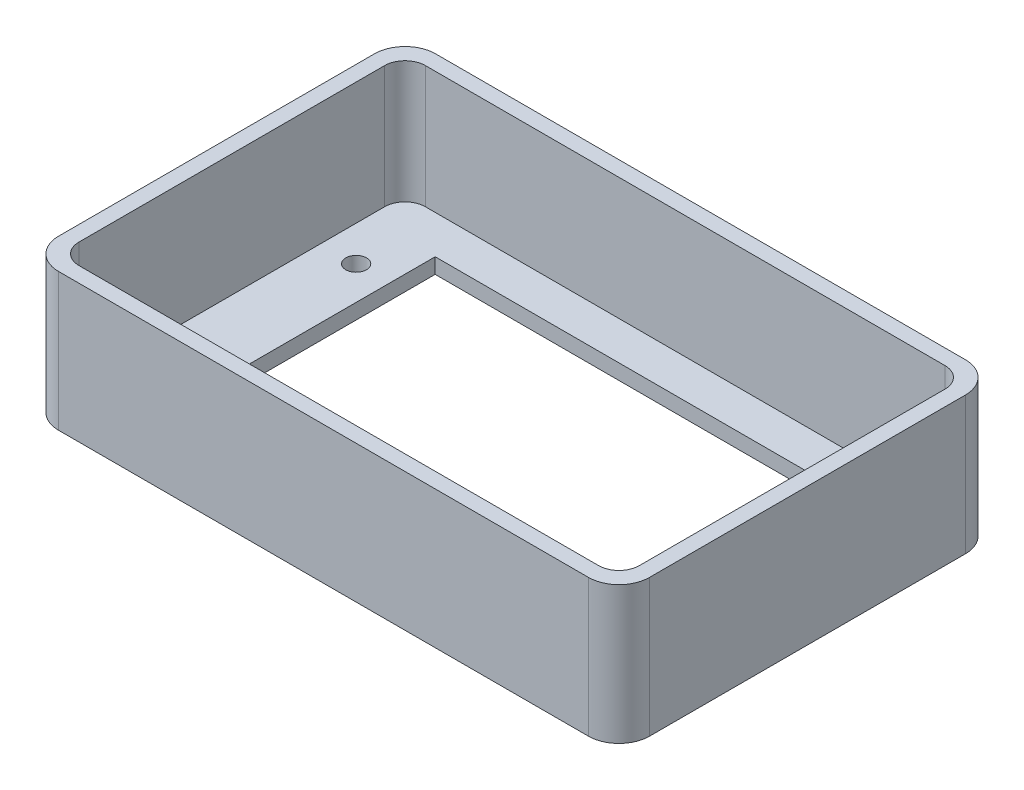
ISO-10303-21;
HEADER;
FILE_DESCRIPTION(('STEP AP214'),'2;1');
FILE_NAME('part.step','',(''),(''),'','','');
FILE_SCHEMA(('AUTOMOTIVE_DESIGN { 1 0 10303 214 1 1 1 1 }'));
ENDSEC;
DATA;
#1=APPLICATION_CONTEXT('core data for automotive mechanical design processes');
#2=APPLICATION_PROTOCOL_DEFINITION('international standard','automotive_design',2000,#1);
#3=PRODUCT_CONTEXT('',#1,'mechanical');
#4=PRODUCT('Part','Part','',(#3));
#5=PRODUCT_RELATED_PRODUCT_CATEGORY('part','',(#4));
#6=PRODUCT_DEFINITION_FORMATION('','',#4);
#7=PRODUCT_DEFINITION_CONTEXT('part definition',#1,'design');
#8=PRODUCT_DEFINITION('design','',#6,#7);
#9=PRODUCT_DEFINITION_SHAPE('','',#8);
#10=(LENGTH_UNIT() NAMED_UNIT(*) SI_UNIT(.MILLI.,.METRE.));
#11=(NAMED_UNIT(*) PLANE_ANGLE_UNIT() SI_UNIT($,.RADIAN.));
#12=(NAMED_UNIT(*) SI_UNIT($,.STERADIAN.) SOLID_ANGLE_UNIT());
#13=UNCERTAINTY_MEASURE_WITH_UNIT(LENGTH_MEASURE(1.E-05),#10,'distance_accuracy_value','');
#14=(GEOMETRIC_REPRESENTATION_CONTEXT(3) GLOBAL_UNCERTAINTY_ASSIGNED_CONTEXT((#13)) GLOBAL_UNIT_ASSIGNED_CONTEXT((#10,
#11,#12)) REPRESENTATION_CONTEXT('',''));
#15=CARTESIAN_POINT('',(0.,0.,0.));
#16=DIRECTION('',(0.,0.,1.));
#17=DIRECTION('',(1.,0.,0.));
#18=AXIS2_PLACEMENT_3D('',#15,#16,#17);
#19=CARTESIAN_POINT('',(0.,0.,0.));
#20=DIRECTION('',(0.,-1.,0.));
#21=DIRECTION('',(0.,0.,-1.));
#22=AXIS2_PLACEMENT_3D('',#19,#20,#21);
#23=PLANE('',#22);
#24=CARTESIAN_POINT('',(61.0957999999996,0.,-22.2291999999988));
#25=DIRECTION('',(0.,1.,0.));
#26=DIRECTION('',(0.,0.,1.));
#27=AXIS2_PLACEMENT_3D('',#24,#25,#26);
#28=CIRCLE('',#27,2.57999999999899);
#29=CARTESIAN_POINT('',(61.0957999999996,0.,-19.6491999999998));
#30=VERTEX_POINT('',#29);
#31=EDGE_CURVE('E532',#30,#30,#28,.T.);
#32=ORIENTED_EDGE('',*,*,#31,.F.);
#33=EDGE_LOOP('',(#32));
#34=FACE_BOUND('',#33,.T.);
#35=CARTESIAN_POINT('',(61.0957999999998,0.,22.2208000000012));
#36=DIRECTION('',(0.,1.,0.));
#37=DIRECTION('',(0.,0.,1.));
#38=AXIS2_PLACEMENT_3D('',#35,#36,#37);
#39=CIRCLE('',#38,2.57999999999881);
#40=CARTESIAN_POINT('',(61.0957999999998,0.,24.8008));
#41=VERTEX_POINT('',#40);
#42=EDGE_CURVE('E536',#41,#41,#39,.T.);
#43=ORIENTED_EDGE('',*,*,#42,.F.);
#44=EDGE_LOOP('',(#43));
#45=FACE_BOUND('',#44,.T.);
#46=CARTESIAN_POINT('',(-61.0842000000003,0.,22.2208000000018));
#47=DIRECTION('',(0.,1.,0.));
#48=DIRECTION('',(0.,0.,1.));
#49=AXIS2_PLACEMENT_3D('',#46,#47,#48);
#50=CIRCLE('',#49,2.57999999999894);
#51=CARTESIAN_POINT('',(-61.0842000000003,0.,24.8008000000007));
#52=VERTEX_POINT('',#51);
#53=EDGE_CURVE('E546',#52,#52,#50,.T.);
#54=ORIENTED_EDGE('',*,*,#53,.F.);
#55=EDGE_LOOP('',(#54));
#56=FACE_BOUND('',#55,.T.);
#57=CARTESIAN_POINT('',(-61.0842000000005,0.,-22.2291999999982));
#58=DIRECTION('',(0.,1.,0.));
#59=DIRECTION('',(0.,0.,1.));
#60=AXIS2_PLACEMENT_3D('',#57,#58,#59);
#61=CIRCLE('',#60,2.57999999999914);
#62=CARTESIAN_POINT('',(-61.0842000000005,0.,-19.6491999999991));
#63=VERTEX_POINT('',#62);
#64=EDGE_CURVE('E541',#63,#63,#61,.T.);
#65=ORIENTED_EDGE('',*,*,#64,.F.);
#66=EDGE_LOOP('',(#65));
#67=FACE_BOUND('',#66,.T.);
#68=DIRECTION('',(1.,0.,0.));
#69=VECTOR('',#68,1.);
#70=CARTESIAN_POINT('',(69.85,0.,43.18));
#71=LINE('',#70,#69);
#72=CARTESIAN_POINT('',(-64.77,0.,43.18));
#73=VERTEX_POINT('',#72);
#74=CARTESIAN_POINT('',(64.77,0.,43.18));
#75=VERTEX_POINT('',#74);
#76=EDGE_CURVE('E238',#73,#75,#71,.T.);
#77=ORIENTED_EDGE('',*,*,#76,.T.);
#78=CARTESIAN_POINT('',(64.77,0.,38.1));
#79=DIRECTION('',(0.,-1.,0.));
#80=DIRECTION('',(0.,0.,-1.));
#81=AXIS2_PLACEMENT_3D('',#78,#79,#80);
#82=CIRCLE('',#81,5.08);
#83=CARTESIAN_POINT('',(69.85,0.,38.1));
#84=VERTEX_POINT('',#83);
#85=EDGE_CURVE('E304',#75,#84,#82,.F.);
#86=ORIENTED_EDGE('',*,*,#85,.T.);
#87=DIRECTION('',(0.,0.,-1.));
#88=VECTOR('',#87,1.);
#89=CARTESIAN_POINT('',(69.85,0.,-43.18));
#90=LINE('',#89,#88);
#91=CARTESIAN_POINT('',(69.85,0.,-38.1));
#92=VERTEX_POINT('',#91);
#93=EDGE_CURVE('E241',#84,#92,#90,.T.);
#94=ORIENTED_EDGE('',*,*,#93,.T.);
#95=CARTESIAN_POINT('',(64.77,0.,-38.1));
#96=DIRECTION('',(0.,-1.,0.));
#97=DIRECTION('',(0.,0.,-1.));
#98=AXIS2_PLACEMENT_3D('',#95,#96,#97);
#99=CIRCLE('',#98,5.08);
#100=CARTESIAN_POINT('',(64.77,0.,-43.18));
#101=VERTEX_POINT('',#100);
#102=EDGE_CURVE('E298',#92,#101,#99,.F.);
#103=ORIENTED_EDGE('',*,*,#102,.T.);
#104=DIRECTION('',(-1.,0.,0.));
#105=VECTOR('',#104,1.);
#106=CARTESIAN_POINT('',(69.85,0.,-43.18));
#107=LINE('',#106,#105);
#108=CARTESIAN_POINT('',(-64.77,0.,-43.18));
#109=VERTEX_POINT('',#108);
#110=EDGE_CURVE('E226',#101,#109,#107,.T.);
#111=ORIENTED_EDGE('',*,*,#110,.T.);
#112=CARTESIAN_POINT('',(-64.77,0.,-38.1));
#113=DIRECTION('',(0.,-1.,0.));
#114=DIRECTION('',(0.,0.,-1.));
#115=AXIS2_PLACEMENT_3D('',#112,#113,#114);
#116=CIRCLE('',#115,5.08);
#117=CARTESIAN_POINT('',(-69.85,0.,-38.1));
#118=VERTEX_POINT('',#117);
#119=EDGE_CURVE('E300',#109,#118,#116,.F.);
#120=ORIENTED_EDGE('',*,*,#119,.T.);
#121=DIRECTION('',(0.,0.,1.));
#122=VECTOR('',#121,1.);
#123=CARTESIAN_POINT('',(-69.85,0.,-43.18));
#124=LINE('',#123,#122);
#125=CARTESIAN_POINT('',(-69.85,0.,38.1));
#126=VERTEX_POINT('',#125);
#127=EDGE_CURVE('E221',#118,#126,#124,.T.);
#128=ORIENTED_EDGE('',*,*,#127,.T.);
#129=CARTESIAN_POINT('',(-64.77,0.,38.1));
#130=DIRECTION('',(0.,-1.,0.));
#131=DIRECTION('',(0.,0.,-1.));
#132=AXIS2_PLACEMENT_3D('',#129,#130,#131);
#133=CIRCLE('',#132,5.08);
#134=EDGE_CURVE('E302',#126,#73,#133,.F.);
#135=ORIENTED_EDGE('',*,*,#134,.T.);
#136=EDGE_LOOP('',(#77,#86,#94,#103,#111,#120,#128,#135));
#137=FACE_BOUND('',#136,.T.);
#138=DIRECTION('',(-1.,0.,0.));
#139=VECTOR('',#138,1.);
#140=CARTESIAN_POINT('',(52.7558,0.,-33.6042));
#141=LINE('',#140,#139);
#142=CARTESIAN_POINT('',(52.7558,0.,-33.6042));
#143=VERTEX_POINT('',#142);
#144=CARTESIAN_POINT('',(-52.7558,0.,-33.6042));
#145=VERTEX_POINT('',#144);
#146=EDGE_CURVE('E185',#143,#145,#141,.T.);
#147=ORIENTED_EDGE('',*,*,#146,.F.);
#148=DIRECTION('',(0.,0.,-1.));
#149=VECTOR('',#148,1.);
#150=CARTESIAN_POINT('',(52.7558,0.,-33.6042));
#151=LINE('',#150,#149);
#152=CARTESIAN_POINT('',(52.7558,0.,33.6042));
#153=VERTEX_POINT('',#152);
#154=EDGE_CURVE('E196',#153,#143,#151,.T.);
#155=ORIENTED_EDGE('',*,*,#154,.F.);
#156=DIRECTION('',(1.,0.,0.));
#157=VECTOR('',#156,1.);
#158=CARTESIAN_POINT('',(52.7558,0.,33.6042));
#159=LINE('',#158,#157);
#160=CARTESIAN_POINT('',(-52.7558,0.,33.6042));
#161=VERTEX_POINT('',#160);
#162=EDGE_CURVE('E54',#161,#153,#159,.T.);
#163=ORIENTED_EDGE('',*,*,#162,.F.);
#164=DIRECTION('',(0.,0.,1.));
#165=VECTOR('',#164,1.);
#166=CARTESIAN_POINT('',(-52.7558,0.,-33.6042));
#167=LINE('',#166,#165);
#168=EDGE_CURVE('E177',#145,#161,#167,.T.);
#169=ORIENTED_EDGE('',*,*,#168,.F.);
#170=EDGE_LOOP('',(#147,#155,#163,#169));
#171=FACE_BOUND('',#170,.T.);
#172=ADVANCED_FACE('F39',(#34,#45,#56,#67,#137,#171),#23,.F.);
#173=CARTESIAN_POINT('',(0.,30.48,0.));
#174=DIRECTION('',(0.,1.,0.));
#175=DIRECTION('',(0.,0.,1.));
#176=AXIS2_PLACEMENT_3D('',#173,#174,#175);
#177=PLANE('',#176);
#178=DIRECTION('',(-1.,0.,0.));
#179=VECTOR('',#178,1.);
#180=CARTESIAN_POINT('',(73.66,30.48,-46.99));
#181=LINE('',#180,#179);
#182=CARTESIAN_POINT('',(66.04,30.48,-46.99));
#183=VERTEX_POINT('',#182);
#184=CARTESIAN_POINT('',(-66.04,30.48,-46.99));
#185=VERTEX_POINT('',#184);
#186=EDGE_CURVE('E254',#183,#185,#181,.T.);
#187=ORIENTED_EDGE('',*,*,#186,.T.);
#188=CARTESIAN_POINT('',(-66.04,30.48,-39.37));
#189=DIRECTION('',(0.,1.,0.));
#190=DIRECTION('',(0.,0.,1.));
#191=AXIS2_PLACEMENT_3D('',#188,#189,#190);
#192=CIRCLE('',#191,7.62);
#193=CARTESIAN_POINT('',(-73.66,30.48,-39.37));
#194=VERTEX_POINT('',#193);
#195=EDGE_CURVE('E281',#185,#194,#192,.T.);
#196=ORIENTED_EDGE('',*,*,#195,.T.);
#197=DIRECTION('',(0.,0.,1.));
#198=VECTOR('',#197,1.);
#199=CARTESIAN_POINT('',(-73.66,30.48,46.99));
#200=LINE('',#199,#198);
#201=CARTESIAN_POINT('',(-73.66,30.48,39.37));
#202=VERTEX_POINT('',#201);
#203=EDGE_CURVE('E235',#194,#202,#200,.T.);
#204=ORIENTED_EDGE('',*,*,#203,.T.);
#205=CARTESIAN_POINT('',(-66.04,30.48,39.37));
#206=DIRECTION('',(0.,1.,0.));
#207=DIRECTION('',(0.,0.,1.));
#208=AXIS2_PLACEMENT_3D('',#205,#206,#207);
#209=CIRCLE('',#208,7.62);
#210=CARTESIAN_POINT('',(-66.04,30.48,46.99));
#211=VERTEX_POINT('',#210);
#212=EDGE_CURVE('E279',#202,#211,#209,.T.);
#213=ORIENTED_EDGE('',*,*,#212,.T.);
#214=DIRECTION('',(1.,0.,0.));
#215=VECTOR('',#214,1.);
#216=CARTESIAN_POINT('',(73.66,30.48,46.99));
#217=LINE('',#216,#215);
#218=CARTESIAN_POINT('',(66.04,30.48,46.99));
#219=VERTEX_POINT('',#218);
#220=EDGE_CURVE('E248',#211,#219,#217,.T.);
#221=ORIENTED_EDGE('',*,*,#220,.T.);
#222=CARTESIAN_POINT('',(66.04,30.48,39.37));
#223=DIRECTION('',(0.,1.,0.));
#224=DIRECTION('',(0.,0.,1.));
#225=AXIS2_PLACEMENT_3D('',#222,#223,#224);
#226=CIRCLE('',#225,7.62);
#227=CARTESIAN_POINT('',(73.66,30.48,39.37));
#228=VERTEX_POINT('',#227);
#229=EDGE_CURVE('E277',#219,#228,#226,.T.);
#230=ORIENTED_EDGE('',*,*,#229,.T.);
#231=DIRECTION('',(0.,0.,-1.));
#232=VECTOR('',#231,1.);
#233=CARTESIAN_POINT('',(73.66,30.48,46.99));
#234=LINE('',#233,#232);
#235=CARTESIAN_POINT('',(73.66,30.48,-39.37));
#236=VERTEX_POINT('',#235);
#237=EDGE_CURVE('E251',#228,#236,#234,.T.);
#238=ORIENTED_EDGE('',*,*,#237,.T.);
#239=CARTESIAN_POINT('',(66.04,30.48,-39.37));
#240=DIRECTION('',(0.,1.,0.));
#241=DIRECTION('',(0.,0.,1.));
#242=AXIS2_PLACEMENT_3D('',#239,#240,#241);
#243=CIRCLE('',#242,7.62);
#244=EDGE_CURVE('E275',#236,#183,#243,.T.);
#245=ORIENTED_EDGE('',*,*,#244,.T.);
#246=EDGE_LOOP('',(#187,#196,#204,#213,#221,#230,#238,#245));
#247=FACE_BOUND('',#246,.T.);
#248=DIRECTION('',(1.,0.,0.));
#249=VECTOR('',#248,1.);
#250=CARTESIAN_POINT('',(69.85,30.48,43.18));
#251=LINE('',#250,#249);
#252=CARTESIAN_POINT('',(-64.77,30.48,43.18));
#253=VERTEX_POINT('',#252);
#254=CARTESIAN_POINT('',(64.77,30.48,43.18));
#255=VERTEX_POINT('',#254);
#256=EDGE_CURVE('E225',#253,#255,#251,.T.);
#257=ORIENTED_EDGE('',*,*,#256,.F.);
#258=CARTESIAN_POINT('',(-64.77,30.48,38.1));
#259=DIRECTION('',(0.,1.,0.));
#260=DIRECTION('',(0.,0.,1.));
#261=AXIS2_PLACEMENT_3D('',#258,#259,#260);
#262=CIRCLE('',#261,5.08);
#263=CARTESIAN_POINT('',(-69.85,30.48,38.1));
#264=VERTEX_POINT('',#263);
#265=EDGE_CURVE('E323',#253,#264,#262,.F.);
#266=ORIENTED_EDGE('',*,*,#265,.T.);
#267=DIRECTION('',(0.,0.,1.));
#268=VECTOR('',#267,1.);
#269=CARTESIAN_POINT('',(-69.85,30.48,-43.18));
#270=LINE('',#269,#268);
#271=CARTESIAN_POINT('',(-69.85,30.48,-38.1));
#272=VERTEX_POINT('',#271);
#273=EDGE_CURVE('E222',#272,#264,#270,.T.);
#274=ORIENTED_EDGE('',*,*,#273,.F.);
#275=CARTESIAN_POINT('',(-64.77,30.48,-38.1));
#276=DIRECTION('',(0.,1.,0.));
#277=DIRECTION('',(0.,0.,1.));
#278=AXIS2_PLACEMENT_3D('',#275,#276,#277);
#279=CIRCLE('',#278,5.08);
#280=CARTESIAN_POINT('',(-64.77,30.48,-43.18));
#281=VERTEX_POINT('',#280);
#282=EDGE_CURVE('E47',#272,#281,#279,.F.);
#283=ORIENTED_EDGE('',*,*,#282,.T.);
#284=DIRECTION('',(-1.,0.,0.));
#285=VECTOR('',#284,1.);
#286=CARTESIAN_POINT('',(69.85,30.48,-43.18));
#287=LINE('',#286,#285);
#288=CARTESIAN_POINT('',(64.77,30.48,-43.18));
#289=VERTEX_POINT('',#288);
#290=EDGE_CURVE('E232',#289,#281,#287,.T.);
#291=ORIENTED_EDGE('',*,*,#290,.F.);
#292=CARTESIAN_POINT('',(64.77,30.48,-38.1));
#293=DIRECTION('',(0.,1.,0.));
#294=DIRECTION('',(0.,0.,1.));
#295=AXIS2_PLACEMENT_3D('',#292,#293,#294);
#296=CIRCLE('',#295,5.08);
#297=CARTESIAN_POINT('',(69.85,30.48,-38.1));
#298=VERTEX_POINT('',#297);
#299=EDGE_CURVE('E11',#289,#298,#296,.F.);
#300=ORIENTED_EDGE('',*,*,#299,.T.);
#301=DIRECTION('',(0.,0.,-1.));
#302=VECTOR('',#301,1.);
#303=CARTESIAN_POINT('',(69.85,30.48,-43.18));
#304=LINE('',#303,#302);
#305=CARTESIAN_POINT('',(69.85,30.48,38.1));
#306=VERTEX_POINT('',#305);
#307=EDGE_CURVE('E229',#306,#298,#304,.T.);
#308=ORIENTED_EDGE('',*,*,#307,.F.);
#309=CARTESIAN_POINT('',(64.77,30.48,38.1));
#310=DIRECTION('',(0.,1.,0.));
#311=DIRECTION('',(0.,0.,1.));
#312=AXIS2_PLACEMENT_3D('',#309,#310,#311);
#313=CIRCLE('',#312,5.08);
#314=EDGE_CURVE('E321',#306,#255,#313,.F.);
#315=ORIENTED_EDGE('',*,*,#314,.T.);
#316=EDGE_LOOP('',(#257,#266,#274,#283,#291,#300,#308,#315));
#317=FACE_BOUND('',#316,.T.);
#318=ADVANCED_FACE('F329',(#247,#317),#177,.T.);
#319=CARTESIAN_POINT('',(-73.66,30.48,46.99));
#320=DIRECTION('',(1.,0.,0.));
#321=DIRECTION('',(0.,0.,-1.));
#322=AXIS2_PLACEMENT_3D('',#319,#320,#321);
#323=PLANE('',#322);
#324=ORIENTED_EDGE('',*,*,#203,.F.);
#325=DIRECTION('',(0.,-1.,0.));
#326=VECTOR('',#325,1.);
#327=CARTESIAN_POINT('',(-73.66,30.48,-39.37));
#328=LINE('',#327,#326);
#329=CARTESIAN_POINT('',(-73.66,-3.81,-39.37));
#330=VERTEX_POINT('',#329);
#331=EDGE_CURVE('E259',#194,#330,#328,.T.);
#332=ORIENTED_EDGE('',*,*,#331,.T.);
#333=DIRECTION('',(0.,0.,-1.));
#334=VECTOR('',#333,1.);
#335=CARTESIAN_POINT('',(-73.66,-3.81,46.99));
#336=LINE('',#335,#334);
#337=CARTESIAN_POINT('',(-73.66,-3.81,39.37));
#338=VERTEX_POINT('',#337);
#339=EDGE_CURVE('E190',#338,#330,#336,.T.);
#340=ORIENTED_EDGE('',*,*,#339,.F.);
#341=DIRECTION('',(0.,-1.,0.));
#342=VECTOR('',#341,1.);
#343=CARTESIAN_POINT('',(-73.66,30.48,39.37));
#344=LINE('',#343,#342);
#345=EDGE_CURVE('E257',#338,#202,#344,.F.);
#346=ORIENTED_EDGE('',*,*,#345,.T.);
#347=EDGE_LOOP('',(#324,#332,#340,#346));
#348=FACE_BOUND('',#347,.T.);
#349=ADVANCED_FACE('F375',(#348),#323,.F.);
#350=CARTESIAN_POINT('',(73.66,30.48,46.99));
#351=DIRECTION('',(0.,0.,-1.));
#352=DIRECTION('',(-1.,0.,0.));
#353=AXIS2_PLACEMENT_3D('',#350,#351,#352);
#354=PLANE('',#353);
#355=ORIENTED_EDGE('',*,*,#220,.F.);
#356=DIRECTION('',(0.,-1.,0.));
#357=VECTOR('',#356,1.);
#358=CARTESIAN_POINT('',(-66.04,30.48,46.99));
#359=LINE('',#358,#357);
#360=CARTESIAN_POINT('',(-66.04,-3.81,46.99));
#361=VERTEX_POINT('',#360);
#362=EDGE_CURVE('E285',#211,#361,#359,.T.);
#363=ORIENTED_EDGE('',*,*,#362,.T.);
#364=DIRECTION('',(-1.,0.,0.));
#365=VECTOR('',#364,1.);
#366=CARTESIAN_POINT('',(-73.66,-3.81,46.99));
#367=LINE('',#366,#365);
#368=CARTESIAN_POINT('',(66.04,-3.81,46.99));
#369=VERTEX_POINT('',#368);
#370=EDGE_CURVE('E218',#369,#361,#367,.T.);
#371=ORIENTED_EDGE('',*,*,#370,.F.);
#372=DIRECTION('',(0.,-1.,0.));
#373=VECTOR('',#372,1.);
#374=CARTESIAN_POINT('',(66.04,30.48,46.99));
#375=LINE('',#374,#373);
#376=EDGE_CURVE('E283',#369,#219,#375,.F.);
#377=ORIENTED_EDGE('',*,*,#376,.T.);
#378=EDGE_LOOP('',(#355,#363,#371,#377));
#379=FACE_BOUND('',#378,.T.);
#380=ADVANCED_FACE('F398',(#379),#354,.F.);
#381=CARTESIAN_POINT('',(73.66,30.48,46.99));
#382=DIRECTION('',(-1.,0.,0.));
#383=DIRECTION('',(0.,0.,1.));
#384=AXIS2_PLACEMENT_3D('',#381,#382,#383);
#385=PLANE('',#384);
#386=ORIENTED_EDGE('',*,*,#237,.F.);
#387=DIRECTION('',(0.,-1.,0.));
#388=VECTOR('',#387,1.);
#389=CARTESIAN_POINT('',(73.66,30.48,39.37));
#390=LINE('',#389,#388);
#391=CARTESIAN_POINT('',(73.66,-3.81,39.37));
#392=VERTEX_POINT('',#391);
#393=EDGE_CURVE('E290',#228,#392,#390,.T.);
#394=ORIENTED_EDGE('',*,*,#393,.T.);
#395=DIRECTION('',(0.,0.,1.));
#396=VECTOR('',#395,1.);
#397=CARTESIAN_POINT('',(73.66,-3.81,46.99));
#398=LINE('',#397,#396);
#399=CARTESIAN_POINT('',(73.66,-3.81,-39.37));
#400=VERTEX_POINT('',#399);
#401=EDGE_CURVE('E215',#400,#392,#398,.T.);
#402=ORIENTED_EDGE('',*,*,#401,.F.);
#403=DIRECTION('',(0.,-1.,0.));
#404=VECTOR('',#403,1.);
#405=CARTESIAN_POINT('',(73.66,30.48,-39.37));
#406=LINE('',#405,#404);
#407=EDGE_CURVE('E288',#400,#236,#406,.F.);
#408=ORIENTED_EDGE('',*,*,#407,.T.);
#409=EDGE_LOOP('',(#386,#394,#402,#408));
#410=FACE_BOUND('',#409,.T.);
#411=ADVANCED_FACE('F394',(#410),#385,.F.);
#412=CARTESIAN_POINT('',(73.66,30.48,-46.99));
#413=DIRECTION('',(0.,0.,1.));
#414=DIRECTION('',(1.,0.,0.));
#415=AXIS2_PLACEMENT_3D('',#412,#413,#414);
#416=PLANE('',#415);
#417=DIRECTION('',(1.,0.,0.));
#418=VECTOR('',#417,1.);
#419=CARTESIAN_POINT('',(-73.66,-3.81,-46.99));
#420=LINE('',#419,#418);
#421=CARTESIAN_POINT('',(-66.04,-3.81,-46.99));
#422=VERTEX_POINT('',#421);
#423=CARTESIAN_POINT('',(66.04,-3.81,-46.99));
#424=VERTEX_POINT('',#423);
#425=EDGE_CURVE('E212',#422,#424,#420,.T.);
#426=ORIENTED_EDGE('',*,*,#425,.F.);
#427=DIRECTION('',(0.,-1.,0.));
#428=VECTOR('',#427,1.);
#429=CARTESIAN_POINT('',(-66.04,30.48,-46.99));
#430=LINE('',#429,#428);
#431=EDGE_CURVE('E273',#422,#185,#430,.F.);
#432=ORIENTED_EDGE('',*,*,#431,.T.);
#433=ORIENTED_EDGE('',*,*,#186,.F.);
#434=DIRECTION('',(0.,-1.,0.));
#435=VECTOR('',#434,1.);
#436=CARTESIAN_POINT('',(66.04,30.48,-46.99));
#437=LINE('',#436,#435);
#438=EDGE_CURVE('E270',#183,#424,#437,.T.);
#439=ORIENTED_EDGE('',*,*,#438,.T.);
#440=EDGE_LOOP('',(#426,#432,#433,#439));
#441=FACE_BOUND('',#440,.T.);
#442=ADVANCED_FACE('F390',(#441),#416,.F.);
#443=CARTESIAN_POINT('',(-69.85,30.48,-43.18));
#444=DIRECTION('',(1.,0.,0.));
#445=DIRECTION('',(0.,0.,-1.));
#446=AXIS2_PLACEMENT_3D('',#443,#444,#445);
#447=PLANE('',#446);
#448=ORIENTED_EDGE('',*,*,#273,.T.);
#449=DIRECTION('',(0.,-1.,0.));
#450=VECTOR('',#449,1.);
#451=CARTESIAN_POINT('',(-69.85,0.,38.1));
#452=LINE('',#451,#450);
#453=EDGE_CURVE('E313',#264,#126,#452,.T.);
#454=ORIENTED_EDGE('',*,*,#453,.T.);
#455=ORIENTED_EDGE('',*,*,#127,.F.);
#456=DIRECTION('',(0.,-1.,0.));
#457=VECTOR('',#456,1.);
#458=CARTESIAN_POINT('',(-69.85,30.48,-38.1));
#459=LINE('',#458,#457);
#460=EDGE_CURVE('E311',#118,#272,#459,.F.);
#461=ORIENTED_EDGE('',*,*,#460,.T.);
#462=EDGE_LOOP('',(#448,#454,#455,#461));
#463=FACE_BOUND('',#462,.T.);
#464=ADVANCED_FACE('F342',(#463),#447,.T.);
#465=CARTESIAN_POINT('',(69.85,30.48,43.18));
#466=DIRECTION('',(0.,0.,-1.));
#467=DIRECTION('',(-1.,0.,0.));
#468=AXIS2_PLACEMENT_3D('',#465,#466,#467);
#469=PLANE('',#468);
#470=ORIENTED_EDGE('',*,*,#256,.T.);
#471=DIRECTION('',(0.,-1.,0.));
#472=VECTOR('',#471,1.);
#473=CARTESIAN_POINT('',(64.77,0.,43.18));
#474=LINE('',#473,#472);
#475=EDGE_CURVE('E295',#255,#75,#474,.T.);
#476=ORIENTED_EDGE('',*,*,#475,.T.);
#477=ORIENTED_EDGE('',*,*,#76,.F.);
#478=DIRECTION('',(0.,-1.,0.));
#479=VECTOR('',#478,1.);
#480=CARTESIAN_POINT('',(-64.77,30.48,43.18));
#481=LINE('',#480,#479);
#482=EDGE_CURVE('E293',#73,#253,#481,.F.);
#483=ORIENTED_EDGE('',*,*,#482,.T.);
#484=EDGE_LOOP('',(#470,#476,#477,#483));
#485=FACE_BOUND('',#484,.T.);
#486=ADVANCED_FACE('F350',(#485),#469,.T.);
#487=CARTESIAN_POINT('',(69.85,30.48,-43.18));
#488=DIRECTION('',(-1.,0.,0.));
#489=DIRECTION('',(0.,0.,1.));
#490=AXIS2_PLACEMENT_3D('',#487,#488,#489);
#491=PLANE('',#490);
#492=ORIENTED_EDGE('',*,*,#93,.F.);
#493=DIRECTION('',(0.,-1.,0.));
#494=VECTOR('',#493,1.);
#495=CARTESIAN_POINT('',(69.85,30.48,38.1));
#496=LINE('',#495,#494);
#497=EDGE_CURVE('E309',#84,#306,#496,.F.);
#498=ORIENTED_EDGE('',*,*,#497,.T.);
#499=ORIENTED_EDGE('',*,*,#307,.T.);
#500=DIRECTION('',(0.,-1.,0.));
#501=VECTOR('',#500,1.);
#502=CARTESIAN_POINT('',(69.85,0.,-38.1));
#503=LINE('',#502,#501);
#504=EDGE_CURVE('E306',#298,#92,#503,.T.);
#505=ORIENTED_EDGE('',*,*,#504,.T.);
#506=EDGE_LOOP('',(#492,#498,#499,#505));
#507=FACE_BOUND('',#506,.T.);
#508=ADVANCED_FACE('F358',(#507),#491,.T.);
#509=CARTESIAN_POINT('',(69.85,30.48,-43.18));
#510=DIRECTION('',(0.,0.,1.));
#511=DIRECTION('',(1.,0.,0.));
#512=AXIS2_PLACEMENT_3D('',#509,#510,#511);
#513=PLANE('',#512);
#514=ORIENTED_EDGE('',*,*,#290,.T.);
#515=DIRECTION('',(0.,-1.,0.));
#516=VECTOR('',#515,1.);
#517=CARTESIAN_POINT('',(-64.77,0.,-43.18));
#518=LINE('',#517,#516);
#519=EDGE_CURVE('E318',#281,#109,#518,.T.);
#520=ORIENTED_EDGE('',*,*,#519,.T.);
#521=ORIENTED_EDGE('',*,*,#110,.F.);
#522=DIRECTION('',(0.,-1.,0.));
#523=VECTOR('',#522,1.);
#524=CARTESIAN_POINT('',(64.77,30.48,-43.18));
#525=LINE('',#524,#523);
#526=EDGE_CURVE('E316',#101,#289,#525,.F.);
#527=ORIENTED_EDGE('',*,*,#526,.T.);
#528=EDGE_LOOP('',(#514,#520,#521,#527));
#529=FACE_BOUND('',#528,.T.);
#530=ADVANCED_FACE('F335',(#529),#513,.T.);
#531=CARTESIAN_POINT('',(0.,-3.81,0.));
#532=DIRECTION('',(0.,-1.,0.));
#533=DIRECTION('',(0.,0.,-1.));
#534=AXIS2_PLACEMENT_3D('',#531,#532,#533);
#535=PLANE('',#534);
#536=CARTESIAN_POINT('',(61.0957999999996,-3.81,-22.2291999999988));
#537=DIRECTION('',(0.,-1.,0.));
#538=DIRECTION('',(0.,0.,-1.));
#539=AXIS2_PLACEMENT_3D('',#536,#537,#538);
#540=CIRCLE('',#539,2.57999999999899);
#541=CARTESIAN_POINT('',(61.0957999999996,-3.81,-24.8091999999977));
#542=VERTEX_POINT('',#541);
#543=EDGE_CURVE('E530',#542,#542,#540,.F.);
#544=ORIENTED_EDGE('',*,*,#543,.T.);
#545=EDGE_LOOP('',(#544));
#546=FACE_BOUND('',#545,.T.);
#547=CARTESIAN_POINT('',(61.0957999999998,-3.81,22.2208000000012));
#548=DIRECTION('',(0.,-1.,0.));
#549=DIRECTION('',(0.,0.,-1.));
#550=AXIS2_PLACEMENT_3D('',#547,#548,#549);
#551=CIRCLE('',#550,2.57999999999881);
#552=CARTESIAN_POINT('',(61.0957999999998,-3.81,19.6408000000024));
#553=VERTEX_POINT('',#552);
#554=EDGE_CURVE('E533',#553,#553,#551,.F.);
#555=ORIENTED_EDGE('',*,*,#554,.T.);
#556=EDGE_LOOP('',(#555));
#557=FACE_BOUND('',#556,.T.);
#558=CARTESIAN_POINT('',(-61.0842000000003,-3.81,22.2208000000018));
#559=DIRECTION('',(0.,-1.,0.));
#560=DIRECTION('',(0.,0.,-1.));
#561=AXIS2_PLACEMENT_3D('',#558,#559,#560);
#562=CIRCLE('',#561,2.57999999999894);
#563=CARTESIAN_POINT('',(-61.0842000000003,-3.81,19.6408000000028));
#564=VERTEX_POINT('',#563);
#565=EDGE_CURVE('E574',#564,#564,#562,.F.);
#566=ORIENTED_EDGE('',*,*,#565,.T.);
#567=EDGE_LOOP('',(#566));
#568=FACE_BOUND('',#567,.T.);
#569=CARTESIAN_POINT('',(-61.0842000000005,-3.81,-22.2291999999982));
#570=DIRECTION('',(0.,-1.,0.));
#571=DIRECTION('',(0.,0.,-1.));
#572=AXIS2_PLACEMENT_3D('',#569,#570,#571);
#573=CIRCLE('',#572,2.57999999999914);
#574=CARTESIAN_POINT('',(-61.0842000000005,-3.81,-24.8091999999974));
#575=VERTEX_POINT('',#574);
#576=EDGE_CURVE('E544',#575,#575,#573,.F.);
#577=ORIENTED_EDGE('',*,*,#576,.T.);
#578=EDGE_LOOP('',(#577));
#579=FACE_BOUND('',#578,.T.);
#580=DIRECTION('',(0.,0.,-1.));
#581=VECTOR('',#580,1.);
#582=CARTESIAN_POINT('',(-52.7558,-3.81,-33.6042));
#583=LINE('',#582,#581);
#584=CARTESIAN_POINT('',(-52.7558,-3.81,33.6042));
#585=VERTEX_POINT('',#584);
#586=CARTESIAN_POINT('',(-52.7558,-3.81,-33.6042));
#587=VERTEX_POINT('',#586);
#588=EDGE_CURVE('E62',#585,#587,#583,.T.);
#589=ORIENTED_EDGE('',*,*,#588,.F.);
#590=DIRECTION('',(-1.,0.,0.));
#591=VECTOR('',#590,1.);
#592=CARTESIAN_POINT('',(52.7558,-3.81,33.6042));
#593=LINE('',#592,#591);
#594=CARTESIAN_POINT('',(52.7558,-3.81,33.6042));
#595=VERTEX_POINT('',#594);
#596=EDGE_CURVE('E182',#595,#585,#593,.T.);
#597=ORIENTED_EDGE('',*,*,#596,.F.);
#598=DIRECTION('',(0.,0.,1.));
#599=VECTOR('',#598,1.);
#600=CARTESIAN_POINT('',(52.7558,-3.81,-33.6042));
#601=LINE('',#600,#599);
#602=CARTESIAN_POINT('',(52.7558,-3.81,-33.6042));
#603=VERTEX_POINT('',#602);
#604=EDGE_CURVE('E201',#603,#595,#601,.T.);
#605=ORIENTED_EDGE('',*,*,#604,.F.);
#606=DIRECTION('',(1.,0.,0.));
#607=VECTOR('',#606,1.);
#608=CARTESIAN_POINT('',(52.7558,-3.81,-33.6042));
#609=LINE('',#608,#607);
#610=EDGE_CURVE('E194',#587,#603,#609,.T.);
#611=ORIENTED_EDGE('',*,*,#610,.F.);
#612=EDGE_LOOP('',(#589,#597,#605,#611));
#613=FACE_BOUND('',#612,.T.);
#614=ORIENTED_EDGE('',*,*,#339,.T.);
#615=CARTESIAN_POINT('',(-66.04,-3.81,-39.37));
#616=DIRECTION('',(0.,-1.,0.));
#617=DIRECTION('',(0.,0.,-1.));
#618=AXIS2_PLACEMENT_3D('',#615,#616,#617);
#619=CIRCLE('',#618,7.62);
#620=EDGE_CURVE('E268',#330,#422,#619,.T.);
#621=ORIENTED_EDGE('',*,*,#620,.T.);
#622=ORIENTED_EDGE('',*,*,#425,.T.);
#623=CARTESIAN_POINT('',(66.04,-3.81,-39.37));
#624=DIRECTION('',(0.,-1.,0.));
#625=DIRECTION('',(0.,0.,-1.));
#626=AXIS2_PLACEMENT_3D('',#623,#624,#625);
#627=CIRCLE('',#626,7.62);
#628=EDGE_CURVE('E262',#424,#400,#627,.T.);
#629=ORIENTED_EDGE('',*,*,#628,.T.);
#630=ORIENTED_EDGE('',*,*,#401,.T.);
#631=CARTESIAN_POINT('',(66.04,-3.81,39.37));
#632=DIRECTION('',(0.,-1.,0.));
#633=DIRECTION('',(0.,0.,-1.));
#634=AXIS2_PLACEMENT_3D('',#631,#632,#633);
#635=CIRCLE('',#634,7.62);
#636=EDGE_CURVE('E264',#392,#369,#635,.T.);
#637=ORIENTED_EDGE('',*,*,#636,.T.);
#638=ORIENTED_EDGE('',*,*,#370,.T.);
#639=CARTESIAN_POINT('',(-66.04,-3.81,39.37));
#640=DIRECTION('',(0.,-1.,0.));
#641=DIRECTION('',(0.,0.,-1.));
#642=AXIS2_PLACEMENT_3D('',#639,#640,#641);
#643=CIRCLE('',#642,7.62);
#644=EDGE_CURVE('E266',#361,#338,#643,.T.);
#645=ORIENTED_EDGE('',*,*,#644,.T.);
#646=EDGE_LOOP('',(#614,#621,#622,#629,#630,#637,#638,#645));
#647=FACE_BOUND('',#646,.T.);
#648=ADVANCED_FACE('F382',(#546,#557,#568,#579,#613,#647),#535,.T.);
#649=CARTESIAN_POINT('',(-66.04,30.48,-39.37));
#650=DIRECTION('',(0.,-1.,0.));
#651=DIRECTION('',(0.,0.,-1.));
#652=AXIS2_PLACEMENT_3D('',#649,#650,#651);
#653=CYLINDRICAL_SURFACE('',#652,7.62);
#654=ORIENTED_EDGE('',*,*,#195,.F.);
#655=ORIENTED_EDGE('',*,*,#431,.F.);
#656=ORIENTED_EDGE('',*,*,#620,.F.);
#657=ORIENTED_EDGE('',*,*,#331,.F.);
#658=EDGE_LOOP('',(#654,#655,#656,#657));
#659=FACE_BOUND('',#658,.T.);
#660=ADVANCED_FACE('F406',(#659),#653,.T.);
#661=CARTESIAN_POINT('',(-66.04,30.48,39.37));
#662=DIRECTION('',(0.,-1.,0.));
#663=DIRECTION('',(0.,0.,-1.));
#664=AXIS2_PLACEMENT_3D('',#661,#662,#663);
#665=CYLINDRICAL_SURFACE('',#664,7.62);
#666=ORIENTED_EDGE('',*,*,#212,.F.);
#667=ORIENTED_EDGE('',*,*,#345,.F.);
#668=ORIENTED_EDGE('',*,*,#644,.F.);
#669=ORIENTED_EDGE('',*,*,#362,.F.);
#670=EDGE_LOOP('',(#666,#667,#668,#669));
#671=FACE_BOUND('',#670,.T.);
#672=ADVANCED_FACE('F409',(#671),#665,.T.);
#673=CARTESIAN_POINT('',(66.04,30.48,39.37));
#674=DIRECTION('',(0.,-1.,0.));
#675=DIRECTION('',(0.,0.,-1.));
#676=AXIS2_PLACEMENT_3D('',#673,#674,#675);
#677=CYLINDRICAL_SURFACE('',#676,7.62);
#678=ORIENTED_EDGE('',*,*,#229,.F.);
#679=ORIENTED_EDGE('',*,*,#376,.F.);
#680=ORIENTED_EDGE('',*,*,#636,.F.);
#681=ORIENTED_EDGE('',*,*,#393,.F.);
#682=EDGE_LOOP('',(#678,#679,#680,#681));
#683=FACE_BOUND('',#682,.T.);
#684=ADVANCED_FACE('F413',(#683),#677,.T.);
#685=CARTESIAN_POINT('',(66.04,30.48,-39.37));
#686=DIRECTION('',(0.,-1.,0.));
#687=DIRECTION('',(0.,0.,-1.));
#688=AXIS2_PLACEMENT_3D('',#685,#686,#687);
#689=CYLINDRICAL_SURFACE('',#688,7.62);
#690=ORIENTED_EDGE('',*,*,#244,.F.);
#691=ORIENTED_EDGE('',*,*,#407,.F.);
#692=ORIENTED_EDGE('',*,*,#628,.F.);
#693=ORIENTED_EDGE('',*,*,#438,.F.);
#694=EDGE_LOOP('',(#690,#691,#692,#693));
#695=FACE_BOUND('',#694,.T.);
#696=ADVANCED_FACE('F417',(#695),#689,.T.);
#697=CARTESIAN_POINT('',(64.77,30.48,38.1));
#698=DIRECTION('',(0.,1.,0.));
#699=DIRECTION('',(0.,0.,1.));
#700=AXIS2_PLACEMENT_3D('',#697,#698,#699);
#701=CYLINDRICAL_SURFACE('',#700,5.08);
#702=ORIENTED_EDGE('',*,*,#314,.F.);
#703=ORIENTED_EDGE('',*,*,#497,.F.);
#704=ORIENTED_EDGE('',*,*,#85,.F.);
#705=ORIENTED_EDGE('',*,*,#475,.F.);
#706=EDGE_LOOP('',(#702,#703,#704,#705));
#707=FACE_BOUND('',#706,.T.);
#708=ADVANCED_FACE('F354',(#707),#701,.F.);
#709=CARTESIAN_POINT('',(-64.77,30.48,38.1));
#710=DIRECTION('',(0.,1.,0.));
#711=DIRECTION('',(0.,0.,1.));
#712=AXIS2_PLACEMENT_3D('',#709,#710,#711);
#713=CYLINDRICAL_SURFACE('',#712,5.08);
#714=ORIENTED_EDGE('',*,*,#265,.F.);
#715=ORIENTED_EDGE('',*,*,#482,.F.);
#716=ORIENTED_EDGE('',*,*,#134,.F.);
#717=ORIENTED_EDGE('',*,*,#453,.F.);
#718=EDGE_LOOP('',(#714,#715,#716,#717));
#719=FACE_BOUND('',#718,.T.);
#720=ADVANCED_FACE('F346',(#719),#713,.F.);
#721=CARTESIAN_POINT('',(-64.77,30.48,-38.1));
#722=DIRECTION('',(0.,1.,0.));
#723=DIRECTION('',(0.,0.,1.));
#724=AXIS2_PLACEMENT_3D('',#721,#722,#723);
#725=CYLINDRICAL_SURFACE('',#724,5.08);
#726=ORIENTED_EDGE('',*,*,#282,.F.);
#727=ORIENTED_EDGE('',*,*,#460,.F.);
#728=ORIENTED_EDGE('',*,*,#119,.F.);
#729=ORIENTED_EDGE('',*,*,#519,.F.);
#730=EDGE_LOOP('',(#726,#727,#728,#729));
#731=FACE_BOUND('',#730,.T.);
#732=ADVANCED_FACE('F338',(#731),#725,.F.);
#733=CARTESIAN_POINT('',(64.77,30.48,-38.1));
#734=DIRECTION('',(0.,1.,0.));
#735=DIRECTION('',(0.,0.,1.));
#736=AXIS2_PLACEMENT_3D('',#733,#734,#735);
#737=CYLINDRICAL_SURFACE('',#736,5.08);
#738=ORIENTED_EDGE('',*,*,#299,.F.);
#739=ORIENTED_EDGE('',*,*,#526,.F.);
#740=ORIENTED_EDGE('',*,*,#102,.F.);
#741=ORIENTED_EDGE('',*,*,#504,.F.);
#742=EDGE_LOOP('',(#738,#739,#740,#741));
#743=FACE_BOUND('',#742,.T.);
#744=ADVANCED_FACE('F41',(#743),#737,.F.);
#745=CARTESIAN_POINT('',(-52.7558,30.481,-33.6042));
#746=DIRECTION('',(-1.,0.,0.));
#747=DIRECTION('',(0.,0.,1.));
#748=AXIS2_PLACEMENT_3D('',#745,#746,#747);
#749=PLANE('',#748);
#750=ORIENTED_EDGE('',*,*,#168,.T.);
#751=DIRECTION('',(0.,-1.,0.));
#752=VECTOR('',#751,1.);
#753=CARTESIAN_POINT('',(-52.7558,30.481,33.6042));
#754=LINE('',#753,#752);
#755=EDGE_CURVE('E191',#161,#585,#754,.T.);
#756=ORIENTED_EDGE('',*,*,#755,.T.);
#757=ORIENTED_EDGE('',*,*,#588,.T.);
#758=DIRECTION('',(0.,-1.,0.));
#759=VECTOR('',#758,1.);
#760=CARTESIAN_POINT('',(-52.7558,30.481,-33.6042));
#761=LINE('',#760,#759);
#762=EDGE_CURVE('E173',#145,#587,#761,.T.);
#763=ORIENTED_EDGE('',*,*,#762,.F.);
#764=EDGE_LOOP('',(#750,#756,#757,#763));
#765=FACE_BOUND('',#764,.T.);
#766=ADVANCED_FACE('F175',(#765),#749,.F.);
#767=CARTESIAN_POINT('',(52.7558,30.481,33.6042));
#768=DIRECTION('',(0.,0.,1.));
#769=DIRECTION('',(1.,0.,0.));
#770=AXIS2_PLACEMENT_3D('',#767,#768,#769);
#771=PLANE('',#770);
#772=ORIENTED_EDGE('',*,*,#162,.T.);
#773=DIRECTION('',(0.,-1.,0.));
#774=VECTOR('',#773,1.);
#775=CARTESIAN_POINT('',(52.7558,30.481,33.6042));
#776=LINE('',#775,#774);
#777=EDGE_CURVE('E207',#153,#595,#776,.T.);
#778=ORIENTED_EDGE('',*,*,#777,.T.);
#779=ORIENTED_EDGE('',*,*,#596,.T.);
#780=ORIENTED_EDGE('',*,*,#755,.F.);
#781=EDGE_LOOP('',(#772,#778,#779,#780));
#782=FACE_BOUND('',#781,.T.);
#783=ADVANCED_FACE('F367',(#782),#771,.F.);
#784=CARTESIAN_POINT('',(52.7558,30.481,-33.6042));
#785=DIRECTION('',(1.,0.,0.));
#786=DIRECTION('',(0.,0.,-1.));
#787=AXIS2_PLACEMENT_3D('',#784,#785,#786);
#788=PLANE('',#787);
#789=ORIENTED_EDGE('',*,*,#154,.T.);
#790=DIRECTION('',(0.,-1.,0.));
#791=VECTOR('',#790,1.);
#792=CARTESIAN_POINT('',(52.7558,30.481,-33.6042));
#793=LINE('',#792,#791);
#794=EDGE_CURVE('E181',#143,#603,#793,.T.);
#795=ORIENTED_EDGE('',*,*,#794,.T.);
#796=ORIENTED_EDGE('',*,*,#604,.T.);
#797=ORIENTED_EDGE('',*,*,#777,.F.);
#798=EDGE_LOOP('',(#789,#795,#796,#797));
#799=FACE_BOUND('',#798,.T.);
#800=ADVANCED_FACE('F453',(#799),#788,.F.);
#801=CARTESIAN_POINT('',(52.7558,30.481,-33.6042));
#802=DIRECTION('',(0.,0.,-1.));
#803=DIRECTION('',(-1.,0.,0.));
#804=AXIS2_PLACEMENT_3D('',#801,#802,#803);
#805=PLANE('',#804);
#806=ORIENTED_EDGE('',*,*,#146,.T.);
#807=ORIENTED_EDGE('',*,*,#762,.T.);
#808=ORIENTED_EDGE('',*,*,#610,.T.);
#809=ORIENTED_EDGE('',*,*,#794,.F.);
#810=EDGE_LOOP('',(#806,#807,#808,#809));
#811=FACE_BOUND('',#810,.T.);
#812=ADVANCED_FACE('F186',(#811),#805,.F.);
#813=CARTESIAN_POINT('',(-61.0842000000005,-3.811,-22.2291999999982));
#814=DIRECTION('',(0.,1.,0.));
#815=DIRECTION('',(0.,0.,1.));
#816=AXIS2_PLACEMENT_3D('',#813,#814,#815);
#817=CYLINDRICAL_SURFACE('',#816,2.57999999999914);
#818=ORIENTED_EDGE('',*,*,#576,.F.);
#819=EDGE_LOOP('',(#818));
#820=FACE_BOUND('',#819,.T.);
#821=ORIENTED_EDGE('',*,*,#64,.T.);
#822=EDGE_LOOP('',(#821));
#823=FACE_BOUND('',#822,.T.);
#824=ADVANCED_FACE('F470',(#820,#823),#817,.F.);
#825=CARTESIAN_POINT('',(-61.0842000000003,-3.811,22.2208000000018));
#826=DIRECTION('',(0.,1.,0.));
#827=DIRECTION('',(0.,0.,1.));
#828=AXIS2_PLACEMENT_3D('',#825,#826,#827);
#829=CYLINDRICAL_SURFACE('',#828,2.57999999999894);
#830=ORIENTED_EDGE('',*,*,#565,.F.);
#831=EDGE_LOOP('',(#830));
#832=FACE_BOUND('',#831,.T.);
#833=ORIENTED_EDGE('',*,*,#53,.T.);
#834=EDGE_LOOP('',(#833));
#835=FACE_BOUND('',#834,.T.);
#836=ADVANCED_FACE('F493',(#832,#835),#829,.F.);
#837=CARTESIAN_POINT('',(61.0957999999998,-3.811,22.2208000000012));
#838=DIRECTION('',(0.,1.,0.));
#839=DIRECTION('',(0.,0.,1.));
#840=AXIS2_PLACEMENT_3D('',#837,#838,#839);
#841=CYLINDRICAL_SURFACE('',#840,2.57999999999881);
#842=ORIENTED_EDGE('',*,*,#554,.F.);
#843=EDGE_LOOP('',(#842));
#844=FACE_BOUND('',#843,.T.);
#845=ORIENTED_EDGE('',*,*,#42,.T.);
#846=EDGE_LOOP('',(#845));
#847=FACE_BOUND('',#846,.T.);
#848=ADVANCED_FACE('F503',(#844,#847),#841,.F.);
#849=CARTESIAN_POINT('',(61.0957999999996,-3.811,-22.2291999999988));
#850=DIRECTION('',(0.,1.,0.));
#851=DIRECTION('',(0.,0.,1.));
#852=AXIS2_PLACEMENT_3D('',#849,#850,#851);
#853=CYLINDRICAL_SURFACE('',#852,2.57999999999899);
#854=ORIENTED_EDGE('',*,*,#543,.F.);
#855=EDGE_LOOP('',(#854));
#856=FACE_BOUND('',#855,.T.);
#857=ORIENTED_EDGE('',*,*,#31,.T.);
#858=EDGE_LOOP('',(#857));
#859=FACE_BOUND('',#858,.T.);
#860=ADVANCED_FACE('F513',(#856,#859),#853,.F.);
#861=CLOSED_SHELL('',(#172,#318,#349,#380,#411,#442,#464,#486,#508,#530,#648,#660,#672,#684,
#696,#708,#720,#732,#744,#766,#783,#800,#812,#824,#836,#848,#860));
#862=MANIFOLD_SOLID_BREP('B2',#861);
#863=ADVANCED_BREP_SHAPE_REPRESENTATION('',(#18,#862),#14);
#864=SHAPE_DEFINITION_REPRESENTATION(#9,#863);
ENDSEC;
END-ISO-10303-21;
